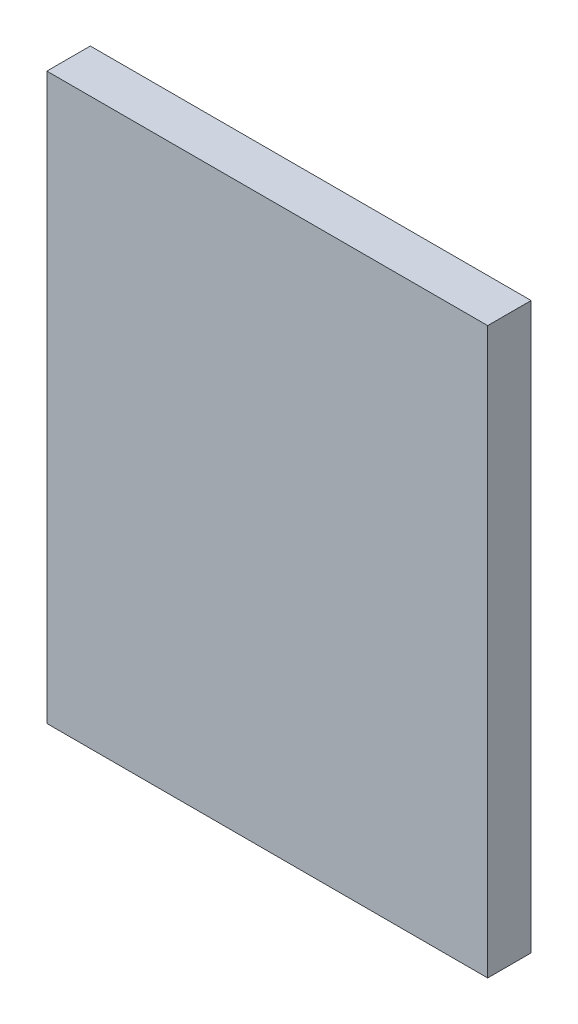
ISO-10303-21;
HEADER;
FILE_DESCRIPTION(('STEP AP214'),'2;1');
FILE_NAME('part.step','',(''),(''),'','','');
FILE_SCHEMA(('AUTOMOTIVE_DESIGN { 1 0 10303 214 1 1 1 1 }'));
ENDSEC;
DATA;
#1=APPLICATION_CONTEXT('core data for automotive mechanical design processes');
#2=APPLICATION_PROTOCOL_DEFINITION('international standard','automotive_design',2000,#1);
#3=PRODUCT_CONTEXT('',#1,'mechanical');
#4=PRODUCT('Part','Part','',(#3));
#5=PRODUCT_RELATED_PRODUCT_CATEGORY('part','',(#4));
#6=PRODUCT_DEFINITION_FORMATION('','',#4);
#7=PRODUCT_DEFINITION_CONTEXT('part definition',#1,'design');
#8=PRODUCT_DEFINITION('design','',#6,#7);
#9=PRODUCT_DEFINITION_SHAPE('','',#8);
#10=(LENGTH_UNIT() NAMED_UNIT(*) SI_UNIT(.MILLI.,.METRE.));
#11=(NAMED_UNIT(*) PLANE_ANGLE_UNIT() SI_UNIT($,.RADIAN.));
#12=(NAMED_UNIT(*) SI_UNIT($,.STERADIAN.) SOLID_ANGLE_UNIT());
#13=UNCERTAINTY_MEASURE_WITH_UNIT(LENGTH_MEASURE(1.E-05),#10,'distance_accuracy_value','');
#14=(GEOMETRIC_REPRESENTATION_CONTEXT(3) GLOBAL_UNCERTAINTY_ASSIGNED_CONTEXT((#13)) GLOBAL_UNIT_ASSIGNED_CONTEXT((#10,
#11,#12)) REPRESENTATION_CONTEXT('',''));
#15=CARTESIAN_POINT('',(0.,0.,0.));
#16=DIRECTION('',(0.,0.,1.));
#17=DIRECTION('',(1.,0.,0.));
#18=AXIS2_PLACEMENT_3D('',#15,#16,#17);
#19=CARTESIAN_POINT('',(0.,0.,1.4));
#20=DIRECTION('',(0.,0.,1.));
#21=DIRECTION('',(1.,0.,0.));
#22=AXIS2_PLACEMENT_3D('',#19,#20,#21);
#23=PLANE('',#22);
#24=DIRECTION('',(0.,-1.,0.));
#25=VECTOR('',#24,1.);
#26=CARTESIAN_POINT('',(7.10000104,9.09999958,1.4));
#27=LINE('',#26,#25);
#28=CARTESIAN_POINT('',(7.10000104,9.09999958,1.4));
#29=VERTEX_POINT('',#28);
#30=CARTESIAN_POINT('',(7.10000104,-9.09999958,1.4));
#31=VERTEX_POINT('',#30);
#32=EDGE_CURVE('E98',#29,#31,#27,.T.);
#33=ORIENTED_EDGE('',*,*,#32,.F.);
#34=DIRECTION('',(1.,0.,0.));
#35=VECTOR('',#34,1.);
#36=CARTESIAN_POINT('',(-7.10000104,9.09999958,1.4));
#37=LINE('',#36,#35);
#38=CARTESIAN_POINT('',(-7.10000104,9.09999958,1.4));
#39=VERTEX_POINT('',#38);
#40=EDGE_CURVE('E78',#39,#29,#37,.T.);
#41=ORIENTED_EDGE('',*,*,#40,.F.);
#42=DIRECTION('',(0.,1.,0.));
#43=VECTOR('',#42,1.);
#44=CARTESIAN_POINT('',(-7.10000104,-9.09999958,1.4));
#45=LINE('',#44,#43);
#46=CARTESIAN_POINT('',(-7.10000104,-9.09999958,1.4));
#47=VERTEX_POINT('',#46);
#48=EDGE_CURVE('E76',#47,#39,#45,.T.);
#49=ORIENTED_EDGE('',*,*,#48,.F.);
#50=DIRECTION('',(-1.,0.,0.));
#51=VECTOR('',#50,1.);
#52=CARTESIAN_POINT('',(7.10000104,-9.09999958,1.4));
#53=LINE('',#52,#51);
#54=EDGE_CURVE('E11',#31,#47,#53,.T.);
#55=ORIENTED_EDGE('',*,*,#54,.F.);
#56=EDGE_LOOP('',(#33,#41,#49,#55));
#57=FACE_BOUND('',#56,.T.);
#58=ADVANCED_FACE('F18',(#57),#23,.T.);
#59=CARTESIAN_POINT('',(-7.10000104,-9.09999958,0.));
#60=DIRECTION('',(0.,-1.,0.));
#61=DIRECTION('',(0.,0.,-1.));
#62=AXIS2_PLACEMENT_3D('',#59,#60,#61);
#63=PLANE('',#62);
#64=DIRECTION('',(2.023816035392E-10,-1.261898522184E-10,-1.));
#65=VECTOR('',#64,1.);
#66=CARTESIAN_POINT('',(7.10000104,-9.09999958,1.4));
#67=LINE('',#66,#65);
#68=CARTESIAN_POINT('',(7.100001040283,-9.099999580177,0.));
#69=VERTEX_POINT('',#68);
#70=EDGE_CURVE('E29',#31,#69,#67,.T.);
#71=ORIENTED_EDGE('',*,*,#70,.F.);
#72=ORIENTED_EDGE('',*,*,#54,.T.);
#73=DIRECTION('',(-2.023816035392E-10,-1.261898522184E-10,-1.));
#74=VECTOR('',#73,1.);
#75=CARTESIAN_POINT('',(-7.10000104,-9.09999958,1.4));
#76=LINE('',#75,#74);
#77=CARTESIAN_POINT('',(-7.100001040283,-9.099999580177,0.));
#78=VERTEX_POINT('',#77);
#79=EDGE_CURVE('E86',#47,#78,#76,.T.);
#80=ORIENTED_EDGE('',*,*,#79,.T.);
#81=DIRECTION('',(-1.,0.,0.));
#82=VECTOR('',#81,1.);
#83=CARTESIAN_POINT('',(7.100001040283,-9.099999580177,0.));
#84=LINE('',#83,#82);
#85=EDGE_CURVE('E22',#69,#78,#84,.T.);
#86=ORIENTED_EDGE('',*,*,#85,.F.);
#87=EDGE_LOOP('',(#71,#72,#80,#86));
#88=FACE_BOUND('',#87,.T.);
#89=ADVANCED_FACE('F156',(#88),#63,.T.);
#90=CARTESIAN_POINT('',(7.10000104,-9.09999958,0.));
#91=DIRECTION('',(1.,0.,0.));
#92=DIRECTION('',(0.,1.,0.));
#93=AXIS2_PLACEMENT_3D('',#90,#91,#92);
#94=PLANE('',#93);
#95=DIRECTION('',(2.023816035392E-10,1.261898522184E-10,-1.));
#96=VECTOR('',#95,1.);
#97=CARTESIAN_POINT('',(7.10000104,9.09999958,1.4));
#98=LINE('',#97,#96);
#99=CARTESIAN_POINT('',(7.100001040283,9.099999580177,0.));
#100=VERTEX_POINT('',#99);
#101=EDGE_CURVE('E57',#29,#100,#98,.T.);
#102=ORIENTED_EDGE('',*,*,#101,.F.);
#103=ORIENTED_EDGE('',*,*,#32,.T.);
#104=ORIENTED_EDGE('',*,*,#70,.T.);
#105=DIRECTION('',(0.,-1.,0.));
#106=VECTOR('',#105,1.);
#107=CARTESIAN_POINT('',(7.100001040283,9.099999580177,0.));
#108=LINE('',#107,#106);
#109=EDGE_CURVE('E90',#100,#69,#108,.T.);
#110=ORIENTED_EDGE('',*,*,#109,.F.);
#111=EDGE_LOOP('',(#102,#103,#104,#110));
#112=FACE_BOUND('',#111,.T.);
#113=ADVANCED_FACE('F143',(#112),#94,.T.);
#114=CARTESIAN_POINT('',(7.10000104,9.09999958,0.));
#115=DIRECTION('',(0.,1.,0.));
#116=DIRECTION('',(1.,0.,0.));
#117=AXIS2_PLACEMENT_3D('',#114,#115,#116);
#118=PLANE('',#117);
#119=DIRECTION('',(-2.023816035392E-10,1.261898522184E-10,-1.));
#120=VECTOR('',#119,1.);
#121=CARTESIAN_POINT('',(-7.10000104,9.09999958,1.4));
#122=LINE('',#121,#120);
#123=CARTESIAN_POINT('',(-7.100001040283,9.099999580177,0.));
#124=VERTEX_POINT('',#123);
#125=EDGE_CURVE('E70',#39,#124,#122,.T.);
#126=ORIENTED_EDGE('',*,*,#125,.F.);
#127=ORIENTED_EDGE('',*,*,#40,.T.);
#128=ORIENTED_EDGE('',*,*,#101,.T.);
#129=DIRECTION('',(1.,0.,0.));
#130=VECTOR('',#129,1.);
#131=CARTESIAN_POINT('',(-7.100001040283,9.099999580177,0.));
#132=LINE('',#131,#130);
#133=EDGE_CURVE('E83',#124,#100,#132,.T.);
#134=ORIENTED_EDGE('',*,*,#133,.F.);
#135=EDGE_LOOP('',(#126,#127,#128,#134));
#136=FACE_BOUND('',#135,.T.);
#137=ADVANCED_FACE('F88',(#136),#118,.T.);
#138=CARTESIAN_POINT('',(-7.10000104,9.09999958,0.));
#139=DIRECTION('',(-1.,0.,0.));
#140=DIRECTION('',(0.,0.,1.));
#141=AXIS2_PLACEMENT_3D('',#138,#139,#140);
#142=PLANE('',#141);
#143=ORIENTED_EDGE('',*,*,#79,.F.);
#144=ORIENTED_EDGE('',*,*,#48,.T.);
#145=ORIENTED_EDGE('',*,*,#125,.T.);
#146=DIRECTION('',(0.,1.,0.));
#147=VECTOR('',#146,1.);
#148=CARTESIAN_POINT('',(-7.100001040283,-9.099999580177,0.));
#149=LINE('',#148,#147);
#150=EDGE_CURVE('E74',#78,#124,#149,.T.);
#151=ORIENTED_EDGE('',*,*,#150,.F.);
#152=EDGE_LOOP('',(#143,#144,#145,#151));
#153=FACE_BOUND('',#152,.T.);
#154=ADVANCED_FACE('F73',(#153),#142,.T.);
#155=CARTESIAN_POINT('',(0.,0.,0.));
#156=DIRECTION('',(0.,0.,1.));
#157=DIRECTION('',(1.,0.,0.));
#158=AXIS2_PLACEMENT_3D('',#155,#156,#157);
#159=PLANE('',#158);
#160=ORIENTED_EDGE('',*,*,#133,.T.);
#161=ORIENTED_EDGE('',*,*,#109,.T.);
#162=ORIENTED_EDGE('',*,*,#85,.T.);
#163=ORIENTED_EDGE('',*,*,#150,.T.);
#164=EDGE_LOOP('',(#160,#161,#162,#163));
#165=FACE_BOUND('',#164,.T.);
#166=ADVANCED_FACE('F20',(#165),#159,.F.);
#167=CLOSED_SHELL('',(#58,#89,#113,#137,#154,#166));
#168=MANIFOLD_SOLID_BREP('B1',#167);
#169=ADVANCED_BREP_SHAPE_REPRESENTATION('',(#18,#168),#14);
#170=SHAPE_DEFINITION_REPRESENTATION(#9,#169);
ENDSEC;
END-ISO-10303-21;
